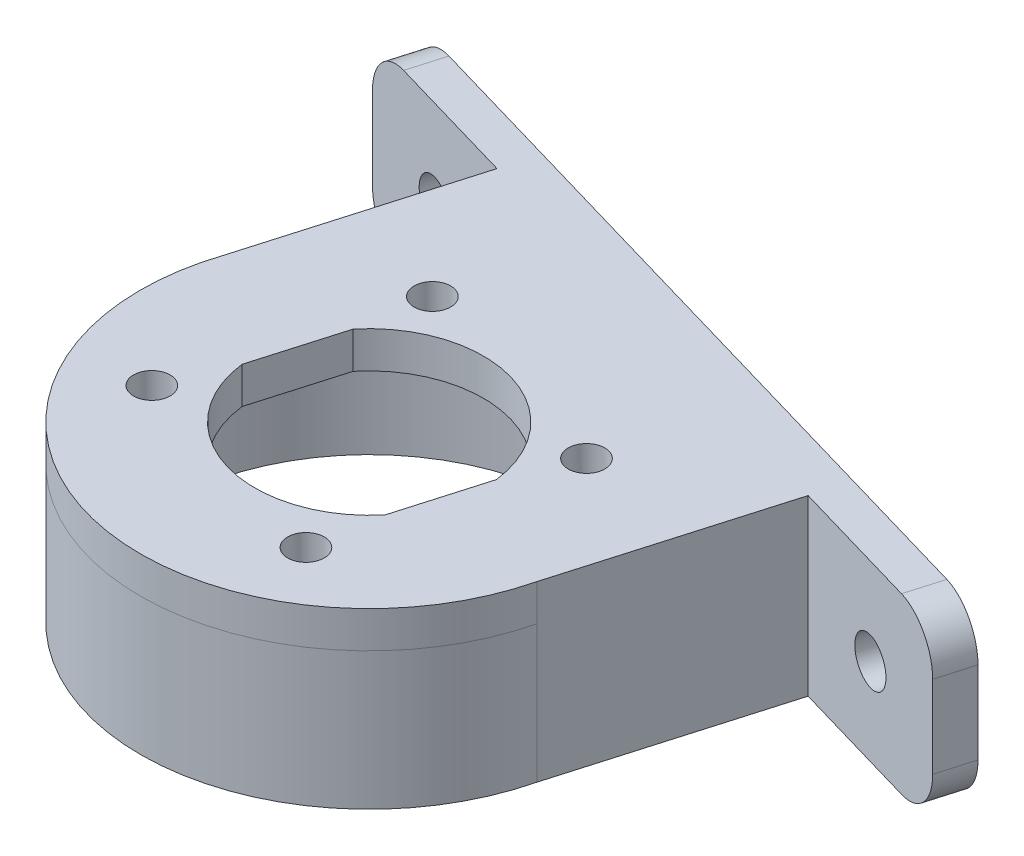
ISO-10303-21;
HEADER;
FILE_DESCRIPTION(('STEP AP214'),'2;1');
FILE_NAME('part.step','',(''),(''),'','','');
FILE_SCHEMA(('AUTOMOTIVE_DESIGN { 1 0 10303 214 1 1 1 1 }'));
ENDSEC;
DATA;
#1=APPLICATION_CONTEXT('core data for automotive mechanical design processes');
#2=APPLICATION_PROTOCOL_DEFINITION('international standard','automotive_design',2000,#1);
#3=PRODUCT_CONTEXT('',#1,'mechanical');
#4=PRODUCT('Part','Part','',(#3));
#5=PRODUCT_RELATED_PRODUCT_CATEGORY('part','',(#4));
#6=PRODUCT_DEFINITION_FORMATION('','',#4);
#7=PRODUCT_DEFINITION_CONTEXT('part definition',#1,'design');
#8=PRODUCT_DEFINITION('design','',#6,#7);
#9=PRODUCT_DEFINITION_SHAPE('','',#8);
#10=(LENGTH_UNIT() NAMED_UNIT(*) SI_UNIT(.MILLI.,.METRE.));
#11=(NAMED_UNIT(*) PLANE_ANGLE_UNIT() SI_UNIT($,.RADIAN.));
#12=(NAMED_UNIT(*) SI_UNIT($,.STERADIAN.) SOLID_ANGLE_UNIT());
#13=UNCERTAINTY_MEASURE_WITH_UNIT(LENGTH_MEASURE(1.E-05),#10,'distance_accuracy_value','');
#14=(GEOMETRIC_REPRESENTATION_CONTEXT(3) GLOBAL_UNCERTAINTY_ASSIGNED_CONTEXT((#13)) GLOBAL_UNIT_ASSIGNED_CONTEXT((#10,
#11,#12)) REPRESENTATION_CONTEXT('',''));
#15=CARTESIAN_POINT('',(0.,0.,0.));
#16=DIRECTION('',(0.,0.,1.));
#17=DIRECTION('',(1.,0.,0.));
#18=AXIS2_PLACEMENT_3D('',#15,#16,#17);
#19=CARTESIAN_POINT('',(0.,0.,0.));
#20=DIRECTION('',(0.,1.,0.));
#21=DIRECTION('',(0.,0.,1.));
#22=AXIS2_PLACEMENT_3D('',#19,#20,#21);
#23=PLANE('',#22);
#24=CARTESIAN_POINT('',(5.88266454172944,0.,48.519689923816));
#25=DIRECTION('',(0.,1.,0.));
#26=DIRECTION('',(0.,0.,1.));
#27=AXIS2_PLACEMENT_3D('',#24,#25,#26);
#28=CIRCLE('',#27,1.99999999999968);
#29=CARTESIAN_POINT('',(5.88266454172944,0.,50.5196899238156));
#30=VERTEX_POINT('',#29);
#31=EDGE_CURVE('E667',#30,#30,#28,.T.);
#32=ORIENTED_EDGE('',*,*,#31,.T.);
#33=EDGE_LOOP('',(#32));
#34=FACE_BOUND('',#33,.T.);
#35=CARTESIAN_POINT('',(12.7949477150797,0.,24.7558446682303));
#36=DIRECTION('',(0.,1.,0.));
#37=DIRECTION('',(0.,0.,1.));
#38=AXIS2_PLACEMENT_3D('',#35,#36,#37);
#39=CIRCLE('',#38,2.00000000000027);
#40=CARTESIAN_POINT('',(12.7949477150797,0.,26.7558446682306));
#41=VERTEX_POINT('',#40);
#42=EDGE_CURVE('E663',#41,#41,#39,.T.);
#43=ORIENTED_EDGE('',*,*,#42,.T.);
#44=EDGE_LOOP('',(#43));
#45=FACE_BOUND('',#44,.T.);
#46=CARTESIAN_POINT('',(36.5587929706653,0.,31.6681278415806));
#47=DIRECTION('',(0.,1.,0.));
#48=DIRECTION('',(0.,0.,1.));
#49=AXIS2_PLACEMENT_3D('',#46,#47,#48);
#50=CIRCLE('',#49,2.);
#51=CARTESIAN_POINT('',(36.5587929706653,0.,33.6681278415806));
#52=VERTEX_POINT('',#51);
#53=EDGE_CURVE('E659',#52,#52,#50,.T.);
#54=ORIENTED_EDGE('',*,*,#53,.T.);
#55=EDGE_LOOP('',(#54));
#56=FACE_BOUND('',#55,.T.);
#57=CARTESIAN_POINT('',(29.6465097973151,0.,55.4319730971662));
#58=DIRECTION('',(0.,1.,0.));
#59=DIRECTION('',(0.,0.,1.));
#60=AXIS2_PLACEMENT_3D('',#57,#58,#59);
#61=CIRCLE('',#60,1.99999999999937);
#62=CARTESIAN_POINT('',(29.6465097973151,0.,57.4319730971655));
#63=VERTEX_POINT('',#62);
#64=EDGE_CURVE('E655',#63,#63,#61,.T.);
#65=ORIENTED_EDGE('',*,*,#64,.T.);
#66=EDGE_LOOP('',(#65));
#67=FACE_BOUND('',#66,.T.);
#68=CARTESIAN_POINT('',(21.2207287561971,0.,40.0939088826978));
#69=DIRECTION('',(0.,1.,0.));
#70=DIRECTION('',(0.,0.,1.));
#71=AXIS2_PLACEMENT_3D('',#68,#69,#70);
#72=CIRCLE('',#71,12.5);
#73=CARTESIAN_POINT('',(8.81010151225684,0.,41.5859984952772));
#74=VERTEX_POINT('',#73);
#75=CARTESIAN_POINT('',(30.8948015652695,0.,48.009862096605));
#76=VERTEX_POINT('',#75);
#77=EDGE_CURVE('E237',#74,#76,#72,.T.);
#78=ORIENTED_EDGE('',*,*,#77,.T.);
#79=DIRECTION('',(0.279298417449034,0.,-0.960204350130984));
#80=VECTOR('',#79,1.);
#81=CARTESIAN_POINT('',(41.3602275698971,0.,12.0306121337904));
#82=LINE('',#81,#80);
#83=CARTESIAN_POINT('',(33.6313560001374,0.,38.6018192701185));
#84=VERTEX_POINT('',#83);
#85=EDGE_CURVE('E651',#76,#84,#82,.T.);
#86=ORIENTED_EDGE('',*,*,#85,.T.);
#87=CARTESIAN_POINT('',(21.2207287561971,0.,40.0939088826978));
#88=DIRECTION('',(0.,1.,0.));
#89=DIRECTION('',(0.,0.,1.));
#90=AXIS2_PLACEMENT_3D('',#87,#88,#89);
#91=CIRCLE('',#90,12.5);
#92=CARTESIAN_POINT('',(11.5466559471248,0.,32.1779556687906));
#93=VERTEX_POINT('',#92);
#94=EDGE_CURVE('E648',#84,#93,#91,.T.);
#95=ORIENTED_EDGE('',*,*,#94,.T.);
#96=DIRECTION('',(0.279298417449035,0.,-0.960204350130984));
#97=VECTOR('',#96,1.);
#98=CARTESIAN_POINT('',(19.2755275168845,0.,5.60674853246267));
#99=LINE('',#98,#97);
#100=EDGE_CURVE('E644',#74,#93,#99,.T.);
#101=ORIENTED_EDGE('',*,*,#100,.F.);
#102=EDGE_LOOP('',(#78,#86,#95,#101));
#103=FACE_BOUND('',#102,.T.);
#104=CARTESIAN_POINT('',(21.2207093880555,0.,40.093908619998));
#105=DIRECTION('',(0.,-1.,0.));
#106=DIRECTION('',(0.,0.,-1.));
#107=AXIS2_PLACEMENT_3D('',#104,#105,#106);
#108=CIRCLE('',#107,22.5);
#109=CARTESIAN_POINT('',(21.2207093880555,0.,17.593908619998));
#110=VERTEX_POINT('',#109);
#111=EDGE_CURVE('E231',#110,#110,#108,.T.);
#112=ORIENTED_EDGE('',*,*,#111,.T.);
#113=EDGE_LOOP('',(#112));
#114=FACE_BOUND('',#113,.T.);
#115=ADVANCED_FACE('F40',(#34,#45,#56,#67,#103,#114),#23,.F.);
#116=CARTESIAN_POINT('',(21.2207287561971,4.,40.0939088826978));
#117=DIRECTION('',(0.,-1.,0.));
#118=DIRECTION('',(0.,0.,-1.));
#119=AXIS2_PLACEMENT_3D('',#116,#117,#118);
#120=CYLINDRICAL_SURFACE('',#119,12.5);
#121=ORIENTED_EDGE('',*,*,#77,.F.);
#122=DIRECTION('',(0.,-1.,0.));
#123=VECTOR('',#122,1.);
#124=CARTESIAN_POINT('',(8.81010151225684,4.,41.5859984952772));
#125=LINE('',#124,#123);
#126=CARTESIAN_POINT('',(8.81010151225684,4.,41.5859984952772));
#127=VERTEX_POINT('',#126);
#128=EDGE_CURVE('E279',#127,#74,#125,.T.);
#129=ORIENTED_EDGE('',*,*,#128,.F.);
#130=CARTESIAN_POINT('',(21.2207287561971,4.,40.0939088826978));
#131=DIRECTION('',(0.,1.,0.));
#132=DIRECTION('',(0.,0.,1.));
#133=AXIS2_PLACEMENT_3D('',#130,#131,#132);
#134=CIRCLE('',#133,12.5);
#135=CARTESIAN_POINT('',(30.8948015652695,4.,48.009862096605));
#136=VERTEX_POINT('',#135);
#137=EDGE_CURVE('E242',#127,#136,#134,.T.);
#138=ORIENTED_EDGE('',*,*,#137,.T.);
#139=DIRECTION('',(0.,-1.,0.));
#140=VECTOR('',#139,1.);
#141=CARTESIAN_POINT('',(30.8948015652695,4.,48.009862096605));
#142=LINE('',#141,#140);
#143=EDGE_CURVE('E628',#136,#76,#142,.T.);
#144=ORIENTED_EDGE('',*,*,#143,.T.);
#145=EDGE_LOOP('',(#121,#129,#138,#144));
#146=FACE_BOUND('',#145,.T.);
#147=ADVANCED_FACE('F265',(#146),#120,.F.);
#148=CARTESIAN_POINT('',(19.2755275168845,4.,5.60674853246267));
#149=DIRECTION('',(-0.960204350130984,0.,-0.279298417449035));
#150=DIRECTION('',(-0.279298417449035,0.,0.960204350130984));
#151=AXIS2_PLACEMENT_3D('',#148,#149,#150);
#152=PLANE('',#151);
#153=ORIENTED_EDGE('',*,*,#100,.T.);
#154=DIRECTION('',(0.,-1.,0.));
#155=VECTOR('',#154,1.);
#156=CARTESIAN_POINT('',(11.5466559471248,4.,32.1779556687906));
#157=LINE('',#156,#155);
#158=CARTESIAN_POINT('',(11.5466559471248,4.,32.1779556687906));
#159=VERTEX_POINT('',#158);
#160=EDGE_CURVE('E672',#159,#93,#157,.T.);
#161=ORIENTED_EDGE('',*,*,#160,.F.);
#162=DIRECTION('',(0.279298417449035,0.,-0.960204350130984));
#163=VECTOR('',#162,1.);
#164=CARTESIAN_POINT('',(19.2755275168845,4.,5.60674853246267));
#165=LINE('',#164,#163);
#166=EDGE_CURVE('E680',#127,#159,#165,.T.);
#167=ORIENTED_EDGE('',*,*,#166,.F.);
#168=ORIENTED_EDGE('',*,*,#128,.T.);
#169=EDGE_LOOP('',(#153,#161,#167,#168));
#170=FACE_BOUND('',#169,.T.);
#171=ADVANCED_FACE('F476',(#170),#152,.F.);
#172=CARTESIAN_POINT('',(21.2207287561971,4.,40.0939088826978));
#173=DIRECTION('',(0.,-1.,0.));
#174=DIRECTION('',(0.,0.,-1.));
#175=AXIS2_PLACEMENT_3D('',#172,#173,#174);
#176=CYLINDRICAL_SURFACE('',#175,12.5);
#177=ORIENTED_EDGE('',*,*,#94,.F.);
#178=DIRECTION('',(0.,-1.,0.));
#179=VECTOR('',#178,1.);
#180=CARTESIAN_POINT('',(33.6313560001374,4.,38.6018192701185));
#181=LINE('',#180,#179);
#182=CARTESIAN_POINT('',(33.6313560001374,4.,38.6018192701185));
#183=VERTEX_POINT('',#182);
#184=EDGE_CURVE('E633',#183,#84,#181,.T.);
#185=ORIENTED_EDGE('',*,*,#184,.F.);
#186=CARTESIAN_POINT('',(21.2207287561971,4.,40.0939088826978));
#187=DIRECTION('',(0.,1.,0.));
#188=DIRECTION('',(0.,0.,1.));
#189=AXIS2_PLACEMENT_3D('',#186,#187,#188);
#190=CIRCLE('',#189,12.5);
#191=EDGE_CURVE('E690',#183,#159,#190,.T.);
#192=ORIENTED_EDGE('',*,*,#191,.T.);
#193=ORIENTED_EDGE('',*,*,#160,.T.);
#194=EDGE_LOOP('',(#177,#185,#192,#193));
#195=FACE_BOUND('',#194,.T.);
#196=ADVANCED_FACE('F462',(#195),#176,.F.);
#197=CARTESIAN_POINT('',(5.88266454172944,4.,48.519689923816));
#198=DIRECTION('',(0.,-1.,0.));
#199=DIRECTION('',(0.,0.,-1.));
#200=AXIS2_PLACEMENT_3D('',#197,#198,#199);
#201=CYLINDRICAL_SURFACE('',#200,1.99999999999968);
#202=CARTESIAN_POINT('',(5.88266454172944,4.,48.519689923816));
#203=DIRECTION('',(0.,1.,0.));
#204=DIRECTION('',(0.,0.,1.));
#205=AXIS2_PLACEMENT_3D('',#202,#203,#204);
#206=CIRCLE('',#205,1.99999999999968);
#207=CARTESIAN_POINT('',(5.88266454172944,4.,50.5196899238156));
#208=VERTEX_POINT('',#207);
#209=EDGE_CURVE('E629',#208,#208,#206,.T.);
#210=ORIENTED_EDGE('',*,*,#209,.T.);
#211=EDGE_LOOP('',(#210));
#212=FACE_BOUND('',#211,.T.);
#213=ORIENTED_EDGE('',*,*,#31,.F.);
#214=EDGE_LOOP('',(#213));
#215=FACE_BOUND('',#214,.T.);
#216=ADVANCED_FACE('F272',(#212,#215),#201,.F.);
#217=CARTESIAN_POINT('',(12.7949477150797,4.,24.7558446682303));
#218=DIRECTION('',(0.,-1.,0.));
#219=DIRECTION('',(0.,0.,-1.));
#220=AXIS2_PLACEMENT_3D('',#217,#218,#219);
#221=CYLINDRICAL_SURFACE('',#220,2.00000000000027);
#222=CARTESIAN_POINT('',(12.7949477150797,4.,24.7558446682303));
#223=DIRECTION('',(0.,1.,0.));
#224=DIRECTION('',(0.,0.,1.));
#225=AXIS2_PLACEMENT_3D('',#222,#223,#224);
#226=CIRCLE('',#225,2.00000000000027);
#227=CARTESIAN_POINT('',(12.7949477150797,4.,26.7558446682306));
#228=VERTEX_POINT('',#227);
#229=EDGE_CURVE('E637',#228,#228,#226,.T.);
#230=ORIENTED_EDGE('',*,*,#229,.T.);
#231=EDGE_LOOP('',(#230));
#232=FACE_BOUND('',#231,.T.);
#233=ORIENTED_EDGE('',*,*,#42,.F.);
#234=EDGE_LOOP('',(#233));
#235=FACE_BOUND('',#234,.T.);
#236=ADVANCED_FACE('F461',(#232,#235),#221,.F.);
#237=CARTESIAN_POINT('',(36.5587929706653,4.,31.6681278415806));
#238=DIRECTION('',(0.,-1.,0.));
#239=DIRECTION('',(0.,0.,-1.));
#240=AXIS2_PLACEMENT_3D('',#237,#238,#239);
#241=CYLINDRICAL_SURFACE('',#240,2.);
#242=CARTESIAN_POINT('',(36.5587929706653,4.,31.6681278415806));
#243=DIRECTION('',(0.,1.,0.));
#244=DIRECTION('',(0.,0.,1.));
#245=AXIS2_PLACEMENT_3D('',#242,#243,#244);
#246=CIRCLE('',#245,2.);
#247=CARTESIAN_POINT('',(36.5587929706653,4.,33.6681278415806));
#248=VERTEX_POINT('',#247);
#249=EDGE_CURVE('E701',#248,#248,#246,.T.);
#250=ORIENTED_EDGE('',*,*,#249,.T.);
#251=EDGE_LOOP('',(#250));
#252=FACE_BOUND('',#251,.T.);
#253=ORIENTED_EDGE('',*,*,#53,.F.);
#254=EDGE_LOOP('',(#253));
#255=FACE_BOUND('',#254,.T.);
#256=ADVANCED_FACE('F504',(#252,#255),#241,.F.);
#257=CARTESIAN_POINT('',(29.6465097973151,4.,55.4319730971662));
#258=DIRECTION('',(0.,-1.,0.));
#259=DIRECTION('',(0.,0.,-1.));
#260=AXIS2_PLACEMENT_3D('',#257,#258,#259);
#261=CYLINDRICAL_SURFACE('',#260,1.99999999999937);
#262=CARTESIAN_POINT('',(29.6465097973151,4.,55.4319730971662));
#263=DIRECTION('',(0.,1.,0.));
#264=DIRECTION('',(0.,0.,1.));
#265=AXIS2_PLACEMENT_3D('',#262,#263,#264);
#266=CIRCLE('',#265,1.99999999999937);
#267=CARTESIAN_POINT('',(29.6465097973151,4.,57.4319730971655));
#268=VERTEX_POINT('',#267);
#269=EDGE_CURVE('E695',#268,#268,#266,.T.);
#270=ORIENTED_EDGE('',*,*,#269,.T.);
#271=EDGE_LOOP('',(#270));
#272=FACE_BOUND('',#271,.T.);
#273=ORIENTED_EDGE('',*,*,#64,.F.);
#274=EDGE_LOOP('',(#273));
#275=FACE_BOUND('',#274,.T.);
#276=ADVANCED_FACE('F512',(#272,#275),#261,.F.);
#277=CARTESIAN_POINT('',(41.3602275698971,4.,12.0306121337904));
#278=DIRECTION('',(-0.960204350130984,0.,-0.279298417449034));
#279=DIRECTION('',(-0.279298417449034,0.,0.960204350130984));
#280=AXIS2_PLACEMENT_3D('',#277,#278,#279);
#281=PLANE('',#280);
#282=ORIENTED_EDGE('',*,*,#85,.F.);
#283=ORIENTED_EDGE('',*,*,#143,.F.);
#284=DIRECTION('',(0.279298417449034,0.,-0.960204350130984));
#285=VECTOR('',#284,1.);
#286=CARTESIAN_POINT('',(41.3602275698971,4.,12.0306121337904));
#287=LINE('',#286,#285);
#288=EDGE_CURVE('E688',#136,#183,#287,.T.);
#289=ORIENTED_EDGE('',*,*,#288,.T.);
#290=ORIENTED_EDGE('',*,*,#184,.T.);
#291=EDGE_LOOP('',(#282,#283,#289,#290));
#292=FACE_BOUND('',#291,.T.);
#293=ADVANCED_FACE('F270',(#292),#281,.T.);
#294=CARTESIAN_POINT('',(21.2207287561971,4.,40.0939088826978));
#295=DIRECTION('',(0.,-1.,0.));
#296=DIRECTION('',(0.,0.,-1.));
#297=AXIS2_PLACEMENT_3D('',#294,#295,#296);
#298=CYLINDRICAL_SURFACE('',#297,25.);
#299=CARTESIAN_POINT('',(21.2207287561971,0.,40.0939088826978));
#300=DIRECTION('',(0.,1.,0.));
#301=DIRECTION('',(-0.94781900744388,0.,-0.318808922598002));
#302=AXIS2_PLACEMENT_3D('',#299,#300,#301);
#303=CIRCLE('',#302,25.);
#304=CARTESIAN_POINT('',(-2.47475516937952,0.,32.1236828781293));
#305=VERTEX_POINT('',#304);
#306=CARTESIAN_POINT('',(45.5043577050817,0.,46.0357009678456));
#307=VERTEX_POINT('',#306);
#308=EDGE_CURVE('E289',#305,#307,#303,.T.);
#309=ORIENTED_EDGE('',*,*,#308,.T.);
#310=DIRECTION('',(0.,-1.,0.));
#311=VECTOR('',#310,1.);
#312=CARTESIAN_POINT('',(45.5044188890737,4.,46.0354906191071));
#313=LINE('',#312,#311);
#314=CARTESIAN_POINT('',(45.5044188890649,4.,46.0354906191431));
#315=VERTEX_POINT('',#314);
#316=EDGE_CURVE('E341',#315,#307,#313,.T.);
#317=ORIENTED_EDGE('',*,*,#316,.F.);
#318=CARTESIAN_POINT('',(21.2207287561971,4.,40.0939088826978));
#319=DIRECTION('',(0.,1.,0.));
#320=DIRECTION('',(0.,0.,1.));
#321=AXIS2_PLACEMENT_3D('',#318,#319,#320);
#322=CIRCLE('',#321,25.);
#323=CARTESIAN_POINT('',(-2.47481737754773,4.,32.1238967482297));
#324=VERTEX_POINT('',#323);
#325=EDGE_CURVE('E626',#324,#315,#322,.T.);
#326=ORIENTED_EDGE('',*,*,#325,.F.);
#327=DIRECTION('',(0.,-1.,0.));
#328=VECTOR('',#327,1.);
#329=CARTESIAN_POINT('',(-2.47481737754771,4.,32.1238967482297));
#330=LINE('',#329,#328);
#331=EDGE_CURVE('E221',#305,#324,#330,.F.);
#332=ORIENTED_EDGE('',*,*,#331,.F.);
#333=EDGE_LOOP('',(#309,#317,#326,#332));
#334=FACE_BOUND('',#333,.T.);
#335=ADVANCED_FACE('F261',(#334),#298,.T.);
#336=CARTESIAN_POINT('',(0.,4.,0.));
#337=DIRECTION('',(0.,1.,0.));
#338=DIRECTION('',(0.,0.,1.));
#339=AXIS2_PLACEMENT_3D('',#336,#337,#338);
#340=PLANE('',#339);
#341=ORIENTED_EDGE('',*,*,#137,.F.);
#342=ORIENTED_EDGE('',*,*,#166,.T.);
#343=ORIENTED_EDGE('',*,*,#191,.F.);
#344=ORIENTED_EDGE('',*,*,#288,.F.);
#345=EDGE_LOOP('',(#341,#342,#343,#344));
#346=FACE_BOUND('',#345,.T.);
#347=ORIENTED_EDGE('',*,*,#269,.F.);
#348=EDGE_LOOP('',(#347));
#349=FACE_BOUND('',#348,.T.);
#350=ORIENTED_EDGE('',*,*,#249,.F.);
#351=EDGE_LOOP('',(#350));
#352=FACE_BOUND('',#351,.T.);
#353=ORIENTED_EDGE('',*,*,#229,.F.);
#354=EDGE_LOOP('',(#353));
#355=FACE_BOUND('',#354,.T.);
#356=ORIENTED_EDGE('',*,*,#209,.F.);
#357=EDGE_LOOP('',(#356));
#358=FACE_BOUND('',#357,.T.);
#359=DIRECTION('',(-0.960204350130984,0.,-0.279298417449035));
#360=VECTOR('',#359,1.);
#361=CARTESIAN_POINT('',(-0.997494681171622,4.,3.42930239577273));
#362=LINE('',#361,#360);
#363=CARTESIAN_POINT('',(67.706260230089,4.,23.4134339162182));
#364=VERTEX_POINT('',#363);
#365=CARTESIAN_POINT('',(-9.06722188796452,4.,1.08202909109001));
#366=VERTEX_POINT('',#365);
#367=EDGE_CURVE('E344',#364,#366,#362,.T.);
#368=ORIENTED_EDGE('',*,*,#367,.T.);
#369=DIRECTION('',(-0.279298417449035,0.,0.960204350130984));
#370=VECTOR('',#369,1.);
#371=CARTESIAN_POINT('',(-10.1844155577607,4.,4.92284649161395));
#372=LINE('',#371,#370);
#373=CARTESIAN_POINT('',(-10.1844155577607,4.,4.92284649161394));
#374=VERTEX_POINT('',#373);
#375=EDGE_CURVE('E302',#366,#374,#372,.T.);
#376=ORIENTED_EDGE('',*,*,#375,.T.);
#377=DIRECTION('',(-0.960204350130984,0.,-0.279298417449035));
#378=VECTOR('',#377,1.);
#379=CARTESIAN_POINT('',(-2.11468835096776,4.,7.27011979629667));
#380=LINE('',#379,#378);
#381=CARTESIAN_POINT('',(4.21864969420409,4.,9.11232275334946));
#382=VERTEX_POINT('',#381);
#383=EDGE_CURVE('E335',#382,#374,#380,.T.);
#384=ORIENTED_EDGE('',*,*,#383,.F.);
#385=DIRECTION('',(0.279298417449035,0.,-0.960204350130983));
#386=VECTOR('',#385,1.);
#387=CARTESIAN_POINT('',(-145426.039763837,4.,499986.047547698));
#388=LINE('',#387,#386);
#389=EDGE_CURVE('E206',#324,#382,#388,.T.);
#390=ORIENTED_EDGE('',*,*,#389,.F.);
#391=ORIENTED_EDGE('',*,*,#325,.T.);
#392=DIRECTION('',(0.279298417449035,0.,-0.960204350130983));
#393=VECTOR('',#392,1.);
#394=CARTESIAN_POINT('',(-145378.072412223,4.,500000.));
#395=LINE('',#394,#393);
#396=CARTESIAN_POINT('',(52.1860013083281,4.,23.0647750550066));
#397=VERTEX_POINT('',#396);
#398=EDGE_CURVE('E195',#315,#397,#395,.T.);
#399=ORIENTED_EDGE('',*,*,#398,.T.);
#400=CARTESIAN_POINT('',(66.5890665602929,4.,27.2542513167422));
#401=VERTEX_POINT('',#400);
#402=EDGE_CURVE('E200',#401,#397,#380,.T.);
#403=ORIENTED_EDGE('',*,*,#402,.F.);
#404=DIRECTION('',(-0.279298417449035,0.,0.960204350130984));
#405=VECTOR('',#404,1.);
#406=CARTESIAN_POINT('',(67.706260230089,4.,23.4134339162182));
#407=LINE('',#406,#405);
#408=EDGE_CURVE('E300',#401,#364,#407,.F.);
#409=ORIENTED_EDGE('',*,*,#408,.T.);
#410=EDGE_LOOP('',(#368,#376,#384,#390,#391,#399,#403,#409));
#411=FACE_BOUND('',#410,.T.);
#412=ADVANCED_FACE('F258',(#346,#349,#352,#355,#358,#411),#340,.T.);
#413=CARTESIAN_POINT('',(21.2207093880555,-15.,40.093908619998));
#414=DIRECTION('',(0.,-1.,0.));
#415=DIRECTION('',(0.,0.,-1.));
#416=AXIS2_PLACEMENT_3D('',#413,#414,#415);
#417=PLANE('',#416);
#418=DIRECTION('',(-0.960204350130984,0.,-0.279298417449035));
#419=VECTOR('',#418,1.);
#420=CARTESIAN_POINT('',(-2.11468835096776,-15.,7.27011979629667));
#421=LINE('',#420,#419);
#422=CARTESIAN_POINT('',(4.21864969420409,-15.,9.11232275334946));
#423=VERTEX_POINT('',#422);
#424=CARTESIAN_POINT('',(-10.1844155577607,-15.,4.92284649161394));
#425=VERTEX_POINT('',#424);
#426=EDGE_CURVE('E184',#423,#425,#421,.T.);
#427=ORIENTED_EDGE('',*,*,#426,.T.);
#428=DIRECTION('',(-0.279298417449035,0.,0.960204350130984));
#429=VECTOR('',#428,1.);
#430=CARTESIAN_POINT('',(-9.06722188796452,-15.,1.08202909109001));
#431=LINE('',#430,#429);
#432=CARTESIAN_POINT('',(-9.06722188796452,-15.,1.08202909109001));
#433=VERTEX_POINT('',#432);
#434=EDGE_CURVE('E64',#425,#433,#431,.F.);
#435=ORIENTED_EDGE('',*,*,#434,.T.);
#436=DIRECTION('',(-0.960204350130984,0.,-0.279298417449035));
#437=VECTOR('',#436,1.);
#438=CARTESIAN_POINT('',(-0.997494681171621,-15.,3.42930239577273));
#439=LINE('',#438,#437);
#440=CARTESIAN_POINT('',(67.706260230089,-15.,23.4134339162182));
#441=VERTEX_POINT('',#440);
#442=EDGE_CURVE('E330',#441,#433,#439,.T.);
#443=ORIENTED_EDGE('',*,*,#442,.F.);
#444=DIRECTION('',(-0.279298417449035,0.,0.960204350130984));
#445=VECTOR('',#444,1.);
#446=CARTESIAN_POINT('',(66.5890665602929,-15.,27.2542513167422));
#447=LINE('',#446,#445);
#448=CARTESIAN_POINT('',(66.5890665602929,-15.,27.2542513167422));
#449=VERTEX_POINT('',#448);
#450=EDGE_CURVE('E179',#441,#449,#447,.T.);
#451=ORIENTED_EDGE('',*,*,#450,.T.);
#452=CARTESIAN_POINT('',(52.186001308311,-15.,23.0647750550017));
#453=VERTEX_POINT('',#452);
#454=EDGE_CURVE('E173',#449,#453,#421,.T.);
#455=ORIENTED_EDGE('',*,*,#454,.T.);
#456=DIRECTION('',(0.279298417449035,0.,-0.960204350130983));
#457=VECTOR('',#456,1.);
#458=CARTESIAN_POINT('',(-145378.072412223,-15.,500000.));
#459=LINE('',#458,#457);
#460=CARTESIAN_POINT('',(45.5042965192969,-15.,46.0359113160095));
#461=VERTEX_POINT('',#460);
#462=EDGE_CURVE('E177',#461,#453,#459,.T.);
#463=ORIENTED_EDGE('',*,*,#462,.F.);
#464=CARTESIAN_POINT('',(21.2207093880555,-15.,40.093908619998));
#465=DIRECTION('',(0.,-1.,0.));
#466=DIRECTION('',(0.,0.,-1.));
#467=AXIS2_PLACEMENT_3D('',#464,#465,#466);
#468=CIRCLE('',#467,25.);
#469=CARTESIAN_POINT('',(-2.47469295925384,-15.,32.1234690085817));
#470=VERTEX_POINT('',#469);
#471=EDGE_CURVE('E230',#461,#470,#468,.T.);
#472=ORIENTED_EDGE('',*,*,#471,.T.);
#473=DIRECTION('',(0.279298417449035,0.,-0.960204350130983));
#474=VECTOR('',#473,1.);
#475=CARTESIAN_POINT('',(-145426.039763837,-15.,499986.047547698));
#476=LINE('',#475,#474);
#477=EDGE_CURVE('E215',#470,#423,#476,.T.);
#478=ORIENTED_EDGE('',*,*,#477,.T.);
#479=EDGE_LOOP('',(#427,#435,#443,#451,#455,#463,#472,#478));
#480=FACE_BOUND('',#479,.T.);
#481=CARTESIAN_POINT('',(21.2207093880555,-15.,40.093908619998));
#482=DIRECTION('',(0.,-1.,0.));
#483=DIRECTION('',(0.,0.,-1.));
#484=AXIS2_PLACEMENT_3D('',#481,#482,#483);
#485=CIRCLE('',#484,22.5);
#486=CARTESIAN_POINT('',(21.2207093880555,-15.,17.593908619998));
#487=VERTEX_POINT('',#486);
#488=EDGE_CURVE('E226',#487,#487,#485,.T.);
#489=ORIENTED_EDGE('',*,*,#488,.F.);
#490=EDGE_LOOP('',(#489));
#491=FACE_BOUND('',#490,.T.);
#492=ADVANCED_FACE('F175',(#480,#491),#417,.T.);
#493=CARTESIAN_POINT('',(21.2207093880555,-15.,40.093908619998));
#494=DIRECTION('',(0.,1.,0.));
#495=DIRECTION('',(0.,0.,1.));
#496=AXIS2_PLACEMENT_3D('',#493,#494,#495);
#497=CYLINDRICAL_SURFACE('',#496,25.);
#498=ORIENTED_EDGE('',*,*,#471,.F.);
#499=DIRECTION('',(0.,1.,0.));
#500=VECTOR('',#499,1.);
#501=CARTESIAN_POINT('',(45.5042965192969,-15.,46.0359113160095));
#502=LINE('',#501,#500);
#503=EDGE_CURVE('E193',#307,#461,#502,.F.);
#504=ORIENTED_EDGE('',*,*,#503,.F.);
#505=ORIENTED_EDGE('',*,*,#308,.F.);
#506=DIRECTION('',(0.,1.,0.));
#507=VECTOR('',#506,1.);
#508=CARTESIAN_POINT('',(-2.47469295921618,-15.,32.1234690084766));
#509=LINE('',#508,#507);
#510=EDGE_CURVE('E218',#470,#305,#509,.T.);
#511=ORIENTED_EDGE('',*,*,#510,.F.);
#512=EDGE_LOOP('',(#498,#504,#505,#511));
#513=FACE_BOUND('',#512,.T.);
#514=ADVANCED_FACE('F245',(#513),#497,.T.);
#515=CARTESIAN_POINT('',(21.2207093880555,-15.,40.093908619998));
#516=DIRECTION('',(0.,1.,0.));
#517=DIRECTION('',(0.,0.,1.));
#518=AXIS2_PLACEMENT_3D('',#515,#516,#517);
#519=CYLINDRICAL_SURFACE('',#518,22.5);
#520=ORIENTED_EDGE('',*,*,#488,.T.);
#521=EDGE_LOOP('',(#520));
#522=FACE_BOUND('',#521,.T.);
#523=ORIENTED_EDGE('',*,*,#111,.F.);
#524=EDGE_LOOP('',(#523));
#525=FACE_BOUND('',#524,.T.);
#526=ADVANCED_FACE('F255',(#522,#525),#519,.F.);
#527=CARTESIAN_POINT('',(-145426.039763837,-15.,499986.047547698));
#528=DIRECTION('',(-0.960204350130983,0.,-0.279298417449035));
#529=DIRECTION('',(-0.279298417449035,0.,0.960204350130984));
#530=AXIS2_PLACEMENT_3D('',#527,#528,#529);
#531=PLANE('',#530);
#532=ORIENTED_EDGE('',*,*,#510,.T.);
#533=ORIENTED_EDGE('',*,*,#331,.T.);
#534=ORIENTED_EDGE('',*,*,#389,.T.);
#535=DIRECTION('',(0.,1.,0.));
#536=VECTOR('',#535,1.);
#537=CARTESIAN_POINT('',(4.21864969420409,-15.,9.11232275334946));
#538=LINE('',#537,#536);
#539=EDGE_CURVE('E202',#423,#382,#538,.T.);
#540=ORIENTED_EDGE('',*,*,#539,.F.);
#541=ORIENTED_EDGE('',*,*,#477,.F.);
#542=EDGE_LOOP('',(#532,#533,#534,#540,#541));
#543=FACE_BOUND('',#542,.T.);
#544=ADVANCED_FACE('F423',(#543),#531,.T.);
#545=CARTESIAN_POINT('',(-145378.072412223,-15.,500000.));
#546=DIRECTION('',(0.960204350130983,0.,0.279298417449035));
#547=DIRECTION('',(0.279298417449035,0.,-0.960204350130984));
#548=AXIS2_PLACEMENT_3D('',#545,#546,#547);
#549=PLANE('',#548);
#550=ORIENTED_EDGE('',*,*,#398,.F.);
#551=ORIENTED_EDGE('',*,*,#316,.T.);
#552=ORIENTED_EDGE('',*,*,#503,.T.);
#553=ORIENTED_EDGE('',*,*,#462,.T.);
#554=DIRECTION('',(0.,-1.,0.));
#555=VECTOR('',#554,1.);
#556=CARTESIAN_POINT('',(52.1860013083281,-15.,23.0647750550066));
#557=LINE('',#556,#555);
#558=EDGE_CURVE('E191',#397,#453,#557,.T.);
#559=ORIENTED_EDGE('',*,*,#558,.F.);
#560=EDGE_LOOP('',(#550,#551,#552,#553,#559));
#561=FACE_BOUND('',#560,.T.);
#562=ADVANCED_FACE('F190',(#561),#549,.T.);
#563=CARTESIAN_POINT('',(-2.11468835096776,0.,7.27011979629667));
#564=DIRECTION('',(0.279298417449035,0.,-0.960204350130984));
#565=DIRECTION('',(-0.960204350130984,0.,-0.279298417449035));
#566=AXIS2_PLACEMENT_3D('',#563,#564,#565);
#567=PLANE('',#566);
#568=CARTESIAN_POINT('',(-5.38339380710575,-5.5,6.31933857885912));
#569=DIRECTION('',(0.279298417449035,0.,-0.960204350130984));
#570=DIRECTION('',(-0.960204350130984,0.,-0.279298417449035));
#571=AXIS2_PLACEMENT_3D('',#568,#569,#570);
#572=CIRCLE('',#571,2.5);
#573=CARTESIAN_POINT('',(-7.7839046824332,-5.5,5.62109253523653));
#574=VERTEX_POINT('',#573);
#575=EDGE_CURVE('E383',#574,#574,#572,.T.);
#576=ORIENTED_EDGE('',*,*,#575,.T.);
#577=EDGE_LOOP('',(#576));
#578=FACE_BOUND('',#577,.T.);
#579=ORIENTED_EDGE('',*,*,#383,.T.);
#580=CARTESIAN_POINT('',(-10.1844155577607,-1.,4.92284649161394));
#581=DIRECTION('',(0.279298417449035,0.,-0.960204350130984));
#582=DIRECTION('',(-0.960204350130984,0.,-0.279298417449035));
#583=AXIS2_PLACEMENT_3D('',#580,#581,#582);
#584=CIRCLE('',#583,5.);
#585=CARTESIAN_POINT('',(-14.9854373084156,-1.,3.52635440436877));
#586=VERTEX_POINT('',#585);
#587=EDGE_CURVE('E308',#374,#586,#584,.F.);
#588=ORIENTED_EDGE('',*,*,#587,.T.);
#589=DIRECTION('',(0.,1.,0.));
#590=VECTOR('',#589,1.);
#591=CARTESIAN_POINT('',(-14.9854373084156,0.,3.52635440436877));
#592=LINE('',#591,#590);
#593=CARTESIAN_POINT('',(-14.9854373084156,-10.,3.52635440436877));
#594=VERTEX_POINT('',#593);
#595=EDGE_CURVE('E183',#594,#586,#592,.T.);
#596=ORIENTED_EDGE('',*,*,#595,.F.);
#597=CARTESIAN_POINT('',(-10.1844155577607,-10.,4.92284649161394));
#598=DIRECTION('',(0.279298417449035,0.,-0.960204350130984));
#599=DIRECTION('',(-0.960204350130984,0.,-0.279298417449035));
#600=AXIS2_PLACEMENT_3D('',#597,#598,#599);
#601=CIRCLE('',#600,5.);
#602=EDGE_CURVE('E305',#594,#425,#601,.F.);
#603=ORIENTED_EDGE('',*,*,#602,.T.);
#604=ORIENTED_EDGE('',*,*,#426,.F.);
#605=ORIENTED_EDGE('',*,*,#539,.T.);
#606=EDGE_LOOP('',(#579,#588,#596,#603,#604,#605));
#607=FACE_BOUND('',#606,.T.);
#608=ADVANCED_FACE('F360',(#578,#607),#567,.F.);
#609=CARTESIAN_POINT('',(-13.8682436386194,0.,-0.314462996155168));
#610=DIRECTION('',(0.960204350130983,0.,0.279298417449035));
#611=DIRECTION('',(0.279298417449035,0.,-0.960204350130984));
#612=AXIS2_PLACEMENT_3D('',#609,#610,#611);
#613=PLANE('',#612);
#614=ORIENTED_EDGE('',*,*,#595,.T.);
#615=DIRECTION('',(-0.279298417449035,0.,0.960204350130984));
#616=VECTOR('',#615,1.);
#617=CARTESIAN_POINT('',(-13.8682436386194,-1.,-0.314462996155165));
#618=LINE('',#617,#616);
#619=CARTESIAN_POINT('',(-13.8682436386194,-1.,-0.314462996155168));
#620=VERTEX_POINT('',#619);
#621=EDGE_CURVE('E313',#586,#620,#618,.F.);
#622=ORIENTED_EDGE('',*,*,#621,.T.);
#623=DIRECTION('',(0.,1.,0.));
#624=VECTOR('',#623,1.);
#625=CARTESIAN_POINT('',(-13.8682436386194,0.,-0.314462996155168));
#626=LINE('',#625,#624);
#627=CARTESIAN_POINT('',(-13.8682436386194,-10.,-0.314462996155168));
#628=VERTEX_POINT('',#627);
#629=EDGE_CURVE('E333',#628,#620,#626,.T.);
#630=ORIENTED_EDGE('',*,*,#629,.F.);
#631=DIRECTION('',(-0.279298417449035,0.,0.960204350130984));
#632=VECTOR('',#631,1.);
#633=CARTESIAN_POINT('',(-14.9854373084156,-10.,3.52635440436877));
#634=LINE('',#633,#632);
#635=EDGE_CURVE('E310',#628,#594,#634,.T.);
#636=ORIENTED_EDGE('',*,*,#635,.T.);
#637=EDGE_LOOP('',(#614,#622,#630,#636));
#638=FACE_BOUND('',#637,.T.);
#639=ADVANCED_FACE('F374',(#638),#613,.F.);
#640=CARTESIAN_POINT('',(72.5072819807439,0.,24.8099260034634));
#641=DIRECTION('',(-0.960204350130983,0.,-0.279298417449035));
#642=DIRECTION('',(-0.279298417449035,0.,0.960204350130984));
#643=AXIS2_PLACEMENT_3D('',#640,#641,#642);
#644=PLANE('',#643);
#645=DIRECTION('',(0.,-1.,0.));
#646=VECTOR('',#645,1.);
#647=CARTESIAN_POINT('',(72.5072819807439,0.,24.8099260034634));
#648=LINE('',#647,#646);
#649=CARTESIAN_POINT('',(72.5072819807439,-1.,24.8099260034634));
#650=VERTEX_POINT('',#649);
#651=CARTESIAN_POINT('',(72.5072819807439,-10.,24.8099260034634));
#652=VERTEX_POINT('',#651);
#653=EDGE_CURVE('E327',#650,#652,#648,.T.);
#654=ORIENTED_EDGE('',*,*,#653,.F.);
#655=DIRECTION('',(-0.279298417449035,0.,0.960204350130984));
#656=VECTOR('',#655,1.);
#657=CARTESIAN_POINT('',(71.3900883109478,-1.,28.6507434039874));
#658=LINE('',#657,#656);
#659=CARTESIAN_POINT('',(71.3900883109478,-1.,28.6507434039874));
#660=VERTEX_POINT('',#659);
#661=EDGE_CURVE('E48',#650,#660,#658,.T.);
#662=ORIENTED_EDGE('',*,*,#661,.T.);
#663=DIRECTION('',(0.,-1.,0.));
#664=VECTOR('',#663,1.);
#665=CARTESIAN_POINT('',(71.3900883109478,0.,28.6507434039874));
#666=LINE('',#665,#664);
#667=CARTESIAN_POINT('',(71.3900883109478,-10.,28.6507434039874));
#668=VERTEX_POINT('',#667);
#669=EDGE_CURVE('E326',#660,#668,#666,.T.);
#670=ORIENTED_EDGE('',*,*,#669,.T.);
#671=DIRECTION('',(-0.279298417449035,0.,0.960204350130984));
#672=VECTOR('',#671,1.);
#673=CARTESIAN_POINT('',(72.5072819807439,-10.,24.8099260034634));
#674=LINE('',#673,#672);
#675=EDGE_CURVE('E295',#668,#652,#674,.F.);
#676=ORIENTED_EDGE('',*,*,#675,.T.);
#677=EDGE_LOOP('',(#654,#662,#670,#676));
#678=FACE_BOUND('',#677,.T.);
#679=ADVANCED_FACE('F325',(#678),#644,.F.);
#680=CARTESIAN_POINT('',(-0.997494681171622,0.,3.42930239577273));
#681=DIRECTION('',(0.279298417449035,0.,-0.960204350130984));
#682=DIRECTION('',(-0.960204350130984,0.,-0.279298417449035));
#683=AXIS2_PLACEMENT_3D('',#680,#681,#682);
#684=PLANE('',#683);
#685=CARTESIAN_POINT('',(-4.2662001373096,-5.5,2.47852117833519));
#686=DIRECTION('',(0.279298417449035,0.,-0.960204350130984));
#687=DIRECTION('',(-0.960204350130984,0.,-0.279298417449035));
#688=AXIS2_PLACEMENT_3D('',#685,#686,#687);
#689=CIRCLE('',#688,2.5);
#690=CARTESIAN_POINT('',(-6.66671101263706,-5.5,1.7802751347126));
#691=VERTEX_POINT('',#690);
#692=EDGE_CURVE('E386',#691,#691,#689,.T.);
#693=ORIENTED_EDGE('',*,*,#692,.F.);
#694=EDGE_LOOP('',(#693));
#695=FACE_BOUND('',#694,.T.);
#696=CARTESIAN_POINT('',(62.9052384794341,-5.5,22.0169418289731));
#697=DIRECTION('',(0.279298417449035,0.,-0.960204350130984));
#698=DIRECTION('',(-0.960204350130984,0.,-0.279298417449035));
#699=AXIS2_PLACEMENT_3D('',#696,#697,#698);
#700=CIRCLE('',#699,2.5);
#701=CARTESIAN_POINT('',(60.5047276041066,-5.5,21.3186957853505));
#702=VERTEX_POINT('',#701);
#703=EDGE_CURVE('E379',#702,#702,#700,.T.);
#704=ORIENTED_EDGE('',*,*,#703,.F.);
#705=EDGE_LOOP('',(#704));
#706=FACE_BOUND('',#705,.T.);
#707=ORIENTED_EDGE('',*,*,#629,.T.);
#708=CARTESIAN_POINT('',(-9.06722188796452,-1.,1.08202909109001));
#709=DIRECTION('',(0.279298417449035,0.,-0.960204350130984));
#710=DIRECTION('',(-0.960204350130984,0.,-0.279298417449035));
#711=AXIS2_PLACEMENT_3D('',#708,#709,#710);
#712=CIRCLE('',#711,5.);
#713=EDGE_CURVE('E320',#620,#366,#712,.T.);
#714=ORIENTED_EDGE('',*,*,#713,.T.);
#715=ORIENTED_EDGE('',*,*,#367,.F.);
#716=CARTESIAN_POINT('',(67.706260230089,-1.,23.4134339162182));
#717=DIRECTION('',(0.279298417449035,0.,-0.960204350130984));
#718=DIRECTION('',(-0.960204350130984,0.,-0.279298417449035));
#719=AXIS2_PLACEMENT_3D('',#716,#717,#718);
#720=CIRCLE('',#719,5.);
#721=EDGE_CURVE('E315',#364,#650,#720,.T.);
#722=ORIENTED_EDGE('',*,*,#721,.T.);
#723=ORIENTED_EDGE('',*,*,#653,.T.);
#724=CARTESIAN_POINT('',(67.706260230089,-10.,23.4134339162182));
#725=DIRECTION('',(0.279298417449035,0.,-0.960204350130984));
#726=DIRECTION('',(-0.960204350130984,0.,-0.279298417449035));
#727=AXIS2_PLACEMENT_3D('',#724,#725,#726);
#728=CIRCLE('',#727,5.);
#729=EDGE_CURVE('E298',#652,#441,#728,.T.);
#730=ORIENTED_EDGE('',*,*,#729,.T.);
#731=ORIENTED_EDGE('',*,*,#442,.T.);
#732=CARTESIAN_POINT('',(-9.06722188796452,-10.,1.08202909109001));
#733=DIRECTION('',(0.279298417449035,0.,-0.960204350130984));
#734=DIRECTION('',(-0.960204350130984,0.,-0.279298417449035));
#735=AXIS2_PLACEMENT_3D('',#732,#733,#734);
#736=CIRCLE('',#735,5.);
#737=EDGE_CURVE('E317',#433,#628,#736,.T.);
#738=ORIENTED_EDGE('',*,*,#737,.T.);
#739=EDGE_LOOP('',(#707,#714,#715,#722,#723,#730,#731,#738));
#740=FACE_BOUND('',#739,.T.);
#741=ADVANCED_FACE('F376',(#695,#706,#740),#684,.T.);
#742=CARTESIAN_POINT('',(61.7880448096379,-5.5,25.857759229497));
#743=DIRECTION('',(0.279298417449035,0.,-0.960204350130984));
#744=DIRECTION('',(-0.960204350130984,0.,-0.279298417449035));
#745=AXIS2_PLACEMENT_3D('',#742,#743,#744);
#746=CIRCLE('',#745,2.5);
#747=CARTESIAN_POINT('',(59.3875339343105,-5.5,25.1595131858744));
#748=VERTEX_POINT('',#747);
#749=EDGE_CURVE('E382',#748,#748,#746,.T.);
#750=ORIENTED_EDGE('',*,*,#749,.T.);
#751=EDGE_LOOP('',(#750));
#752=FACE_BOUND('',#751,.T.);
#753=ORIENTED_EDGE('',*,*,#669,.F.);
#754=CARTESIAN_POINT('',(66.5890665602929,-1.,27.2542513167422));
#755=DIRECTION('',(0.279298417449035,0.,-0.960204350130984));
#756=DIRECTION('',(-0.960204350130984,0.,-0.279298417449035));
#757=AXIS2_PLACEMENT_3D('',#754,#755,#756);
#758=CIRCLE('',#757,5.);
#759=EDGE_CURVE('E11',#660,#401,#758,.F.);
#760=ORIENTED_EDGE('',*,*,#759,.T.);
#761=ORIENTED_EDGE('',*,*,#402,.T.);
#762=ORIENTED_EDGE('',*,*,#558,.T.);
#763=ORIENTED_EDGE('',*,*,#454,.F.);
#764=CARTESIAN_POINT('',(66.5890665602929,-10.,27.2542513167422));
#765=DIRECTION('',(0.279298417449035,0.,-0.960204350130984));
#766=DIRECTION('',(-0.960204350130984,0.,-0.279298417449035));
#767=AXIS2_PLACEMENT_3D('',#764,#765,#766);
#768=CIRCLE('',#767,5.);
#769=EDGE_CURVE('E293',#449,#668,#768,.F.);
#770=ORIENTED_EDGE('',*,*,#769,.T.);
#771=EDGE_LOOP('',(#753,#760,#761,#762,#763,#770));
#772=FACE_BOUND('',#771,.T.);
#773=ADVANCED_FACE('F198',(#752,#772),#567,.F.);
#774=CARTESIAN_POINT('',(61.7880448096379,-5.5,25.857759229497));
#775=DIRECTION('',(0.279298417449035,0.,-0.960204350130983));
#776=DIRECTION('',(-0.960204350130984,0.,-0.279298417449035));
#777=AXIS2_PLACEMENT_3D('',#774,#775,#776);
#778=CYLINDRICAL_SURFACE('',#777,2.5);
#779=ORIENTED_EDGE('',*,*,#749,.F.);
#780=EDGE_LOOP('',(#779));
#781=FACE_BOUND('',#780,.T.);
#782=ORIENTED_EDGE('',*,*,#703,.T.);
#783=EDGE_LOOP('',(#782));
#784=FACE_BOUND('',#783,.T.);
#785=ADVANCED_FACE('F398',(#781,#784),#778,.F.);
#786=CARTESIAN_POINT('',(-5.38339380710575,-5.5,6.31933857885912));
#787=DIRECTION('',(0.279298417449035,0.,-0.960204350130983));
#788=DIRECTION('',(-0.960204350130984,0.,-0.279298417449035));
#789=AXIS2_PLACEMENT_3D('',#786,#787,#788);
#790=CYLINDRICAL_SURFACE('',#789,2.5);
#791=ORIENTED_EDGE('',*,*,#575,.F.);
#792=EDGE_LOOP('',(#791));
#793=FACE_BOUND('',#792,.T.);
#794=ORIENTED_EDGE('',*,*,#692,.T.);
#795=EDGE_LOOP('',(#794));
#796=FACE_BOUND('',#795,.T.);
#797=ADVANCED_FACE('F394',(#793,#796),#790,.F.);
#798=CARTESIAN_POINT('',(59.6066046836564,-10.,51.2593650220266));
#799=DIRECTION('',(0.279298417449035,0.,-0.960204350130984));
#800=DIRECTION('',(-0.960204350130983,0.,-0.279298417449035));
#801=AXIS2_PLACEMENT_3D('',#798,#799,#800);
#802=CYLINDRICAL_SURFACE('',#801,5.);
#803=ORIENTED_EDGE('',*,*,#729,.F.);
#804=ORIENTED_EDGE('',*,*,#675,.F.);
#805=ORIENTED_EDGE('',*,*,#769,.F.);
#806=ORIENTED_EDGE('',*,*,#450,.F.);
#807=EDGE_LOOP('',(#803,#804,#805,#806));
#808=FACE_BOUND('',#807,.T.);
#809=ADVANCED_FACE('F397',(#808),#802,.T.);
#810=CARTESIAN_POINT('',(-8.0697272067929,-1.,-2.34727330468272));
#811=DIRECTION('',(0.279298417449035,0.,-0.960204350130984));
#812=DIRECTION('',(-0.960204350130983,0.,-0.279298417449035));
#813=AXIS2_PLACEMENT_3D('',#810,#811,#812);
#814=CYLINDRICAL_SURFACE('',#813,5.);
#815=ORIENTED_EDGE('',*,*,#713,.F.);
#816=ORIENTED_EDGE('',*,*,#621,.F.);
#817=ORIENTED_EDGE('',*,*,#587,.F.);
#818=ORIENTED_EDGE('',*,*,#375,.F.);
#819=EDGE_LOOP('',(#815,#816,#817,#818));
#820=FACE_BOUND('',#819,.T.);
#821=ADVANCED_FACE('F371',(#820),#814,.T.);
#822=CARTESIAN_POINT('',(-9.06722188796452,-10.,1.08202909109001));
#823=DIRECTION('',(0.279298417449035,0.,-0.960204350130984));
#824=DIRECTION('',(-0.960204350130983,0.,-0.279298417449035));
#825=AXIS2_PLACEMENT_3D('',#822,#823,#824);
#826=CYLINDRICAL_SURFACE('',#825,5.);
#827=ORIENTED_EDGE('',*,*,#737,.F.);
#828=ORIENTED_EDGE('',*,*,#434,.F.);
#829=ORIENTED_EDGE('',*,*,#602,.F.);
#830=ORIENTED_EDGE('',*,*,#635,.F.);
#831=EDGE_LOOP('',(#827,#828,#829,#830));
#832=FACE_BOUND('',#831,.T.);
#833=ADVANCED_FACE('F605',(#832),#826,.T.);
#834=CARTESIAN_POINT('',(67.706260230089,-1.,23.4134339162182));
#835=DIRECTION('',(0.279298417449035,0.,-0.960204350130984));
#836=DIRECTION('',(-0.960204350130983,0.,-0.279298417449035));
#837=AXIS2_PLACEMENT_3D('',#834,#835,#836);
#838=CYLINDRICAL_SURFACE('',#837,5.);
#839=ORIENTED_EDGE('',*,*,#721,.F.);
#840=ORIENTED_EDGE('',*,*,#408,.F.);
#841=ORIENTED_EDGE('',*,*,#759,.F.);
#842=ORIENTED_EDGE('',*,*,#661,.F.);
#843=EDGE_LOOP('',(#839,#840,#841,#842));
#844=FACE_BOUND('',#843,.T.);
#845=ADVANCED_FACE('F42',(#844),#838,.T.);
#846=CLOSED_SHELL('',(#115,#147,#171,#196,#216,#236,#256,#276,#293,#335,#412,#492,#514,#526,
#544,#562,#608,#639,#679,#741,#773,#785,#797,#809,#821,#833,#845));
#847=MANIFOLD_SOLID_BREP('B2',#846);
#848=ADVANCED_BREP_SHAPE_REPRESENTATION('',(#18,#847),#14);
#849=SHAPE_DEFINITION_REPRESENTATION(#9,#848);
ENDSEC;
END-ISO-10303-21;
